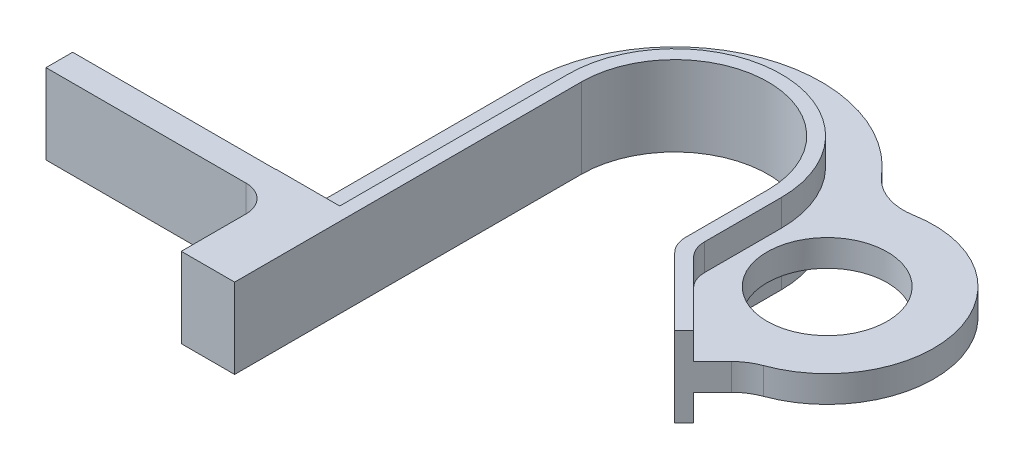
ISO-10303-21;
HEADER;
FILE_DESCRIPTION(('STEP AP214'),'2;1');
FILE_NAME('part.step','',(''),(''),'','','');
FILE_SCHEMA(('AUTOMOTIVE_DESIGN { 1 0 10303 214 1 1 1 1 }'));
ENDSEC;
DATA;
#1=APPLICATION_CONTEXT('core data for automotive mechanical design processes');
#2=APPLICATION_PROTOCOL_DEFINITION('international standard','automotive_design',2000,#1);
#3=PRODUCT_CONTEXT('',#1,'mechanical');
#4=PRODUCT('Part','Part','',(#3));
#5=PRODUCT_RELATED_PRODUCT_CATEGORY('part','',(#4));
#6=PRODUCT_DEFINITION_FORMATION('','',#4);
#7=PRODUCT_DEFINITION_CONTEXT('part definition',#1,'design');
#8=PRODUCT_DEFINITION('design','',#6,#7);
#9=PRODUCT_DEFINITION_SHAPE('','',#8);
#10=(LENGTH_UNIT() NAMED_UNIT(*) SI_UNIT(.MILLI.,.METRE.));
#11=(NAMED_UNIT(*) PLANE_ANGLE_UNIT() SI_UNIT($,.RADIAN.));
#12=(NAMED_UNIT(*) SI_UNIT($,.STERADIAN.) SOLID_ANGLE_UNIT());
#13=UNCERTAINTY_MEASURE_WITH_UNIT(LENGTH_MEASURE(1.E-05),#10,'distance_accuracy_value','');
#14=(GEOMETRIC_REPRESENTATION_CONTEXT(3) GLOBAL_UNCERTAINTY_ASSIGNED_CONTEXT((#13)) GLOBAL_UNIT_ASSIGNED_CONTEXT((#10,
#11,#12)) REPRESENTATION_CONTEXT('',''));
#15=CARTESIAN_POINT('',(0.,0.,0.));
#16=DIRECTION('',(0.,0.,1.));
#17=DIRECTION('',(1.,0.,0.));
#18=AXIS2_PLACEMENT_3D('',#15,#16,#17);
#19=CARTESIAN_POINT('',(-34.925,19.05,82.55));
#20=DIRECTION('',(1.,0.,0.));
#21=DIRECTION('',(0.,0.,-1.));
#22=AXIS2_PLACEMENT_3D('',#19,#20,#21);
#23=PLANE('',#22);
#24=DIRECTION('',(0.,0.,1.));
#25=VECTOR('',#24,1.);
#26=CARTESIAN_POINT('',(-34.925,19.05,54.356));
#27=LINE('',#26,#25);
#28=CARTESIAN_POINT('',(-34.925,19.05,67.1322));
#29=VERTEX_POINT('',#28);
#30=CARTESIAN_POINT('',(-34.925,19.05,82.55));
#31=VERTEX_POINT('',#30);
#32=EDGE_CURVE('E243',#29,#31,#27,.T.);
#33=ORIENTED_EDGE('',*,*,#32,.F.);
#34=DIRECTION('',(0.,1.,0.));
#35=VECTOR('',#34,1.);
#36=CARTESIAN_POINT('',(-34.925,0.,67.1322));
#37=LINE('',#36,#35);
#38=CARTESIAN_POINT('',(-34.925,0.,67.1322));
#39=VERTEX_POINT('',#38);
#40=EDGE_CURVE('E342',#29,#39,#37,.F.);
#41=ORIENTED_EDGE('',*,*,#40,.T.);
#42=DIRECTION('',(0.,0.,1.));
#43=VECTOR('',#42,1.);
#44=CARTESIAN_POINT('',(-34.925,0.,54.356));
#45=LINE('',#44,#43);
#46=CARTESIAN_POINT('',(-34.925,0.,82.55));
#47=VERTEX_POINT('',#46);
#48=EDGE_CURVE('E254',#39,#47,#45,.T.);
#49=ORIENTED_EDGE('',*,*,#48,.T.);
#50=DIRECTION('',(0.,-1.,0.));
#51=VECTOR('',#50,1.);
#52=CARTESIAN_POINT('',(-34.925,19.05,82.55));
#53=LINE('',#52,#51);
#54=EDGE_CURVE('E258',#31,#47,#53,.T.);
#55=ORIENTED_EDGE('',*,*,#54,.F.);
#56=EDGE_LOOP('',(#33,#41,#49,#55));
#57=FACE_BOUND('',#56,.T.);
#58=ADVANCED_FACE('F34',(#57),#23,.F.);
#59=DIRECTION('',(0.,0.,1.));
#60=VECTOR('',#59,1.);
#61=CARTESIAN_POINT('',(-34.925,6.35,0.));
#62=LINE('',#61,#60);
#63=CARTESIAN_POINT('',(-34.925,6.35,0.));
#64=VERTEX_POINT('',#63);
#65=CARTESIAN_POINT('',(-34.925,6.35,48.0822));
#66=VERTEX_POINT('',#65);
#67=EDGE_CURVE('E447',#64,#66,#62,.T.);
#68=ORIENTED_EDGE('',*,*,#67,.T.);
#69=DIRECTION('',(0.,-1.,0.));
#70=VECTOR('',#69,1.);
#71=CARTESIAN_POINT('',(-34.925,19.05,48.0822));
#72=LINE('',#71,#70);
#73=CARTESIAN_POINT('',(-34.925,12.7,48.0822));
#74=VERTEX_POINT('',#73);
#75=EDGE_CURVE('E350',#66,#74,#72,.F.);
#76=ORIENTED_EDGE('',*,*,#75,.T.);
#77=DIRECTION('',(0.,0.,1.));
#78=VECTOR('',#77,1.);
#79=CARTESIAN_POINT('',(-34.925,12.7,0.));
#80=LINE('',#79,#78);
#81=CARTESIAN_POINT('',(-34.925,12.7,0.));
#82=VERTEX_POINT('',#81);
#83=EDGE_CURVE('E469',#82,#74,#80,.T.);
#84=ORIENTED_EDGE('',*,*,#83,.F.);
#85=DIRECTION('',(0.,-1.,0.));
#86=VECTOR('',#85,1.);
#87=CARTESIAN_POINT('',(-34.925,19.05,0.));
#88=LINE('',#87,#86);
#89=EDGE_CURVE('E262',#82,#64,#88,.T.);
#90=ORIENTED_EDGE('',*,*,#89,.T.);
#91=EDGE_LOOP('',(#68,#76,#84,#90));
#92=FACE_BOUND('',#91,.T.);
#93=ADVANCED_FACE('F533',(#92),#23,.F.);
#94=CARTESIAN_POINT('',(-25.4,12.7,0.));
#95=DIRECTION('',(1.,0.,0.));
#96=DIRECTION('',(0.,0.,-1.));
#97=AXIS2_PLACEMENT_3D('',#94,#95,#96);
#98=PLANE('',#97);
#99=DIRECTION('',(0.,0.,-1.));
#100=VECTOR('',#99,1.);
#101=CARTESIAN_POINT('',(-25.4,12.7,0.));
#102=LINE('',#101,#100);
#103=CARTESIAN_POINT('',(-25.4,12.7,54.356));
#104=VERTEX_POINT('',#103);
#105=CARTESIAN_POINT('',(-25.4,12.7,0.));
#106=VERTEX_POINT('',#105);
#107=EDGE_CURVE('E473',#104,#106,#102,.T.);
#108=ORIENTED_EDGE('',*,*,#107,.F.);
#109=DIRECTION('',(0.,1.,0.));
#110=VECTOR('',#109,1.);
#111=CARTESIAN_POINT('',(-25.4,12.7,54.356));
#112=LINE('',#111,#110);
#113=CARTESIAN_POINT('',(-25.4,19.05,54.356));
#114=VERTEX_POINT('',#113);
#115=EDGE_CURVE('E410',#104,#114,#112,.T.);
#116=ORIENTED_EDGE('',*,*,#115,.T.);
#117=DIRECTION('',(0.,0.,-1.));
#118=VECTOR('',#117,1.);
#119=CARTESIAN_POINT('',(-25.4,19.05,0.));
#120=LINE('',#119,#118);
#121=CARTESIAN_POINT('',(-25.4,19.05,0.));
#122=VERTEX_POINT('',#121);
#123=EDGE_CURVE('E462',#114,#122,#120,.T.);
#124=ORIENTED_EDGE('',*,*,#123,.T.);
#125=DIRECTION('',(0.,1.,0.));
#126=VECTOR('',#125,1.);
#127=CARTESIAN_POINT('',(-25.4,12.7,0.));
#128=LINE('',#127,#126);
#129=EDGE_CURVE('E277',#106,#122,#128,.T.);
#130=ORIENTED_EDGE('',*,*,#129,.F.);
#131=EDGE_LOOP('',(#108,#116,#124,#130));
#132=FACE_BOUND('',#131,.T.);
#133=ADVANCED_FACE('F538',(#132),#98,.F.);
#134=CARTESIAN_POINT('',(0.,12.7,0.));
#135=DIRECTION('',(0.,1.,0.));
#136=DIRECTION('',(0.,0.,1.));
#137=AXIS2_PLACEMENT_3D('',#134,#135,#136);
#138=PLANE('',#137);
#139=CARTESIAN_POINT('',(42.884078450907,12.7,6.59427540420827));
#140=DIRECTION('',(0.,1.,0.));
#141=DIRECTION('',(0.,0.,1.));
#142=AXIS2_PLACEMENT_3D('',#139,#140,#141);
#143=CIRCLE('',#142,14.309078450907);
#144=CARTESIAN_POINT('',(42.884078450907,12.7,20.9033538551152));
#145=VERTEX_POINT('',#144);
#146=EDGE_CURVE('E399',#145,#145,#143,.T.);
#147=ORIENTED_EDGE('',*,*,#146,.F.);
#148=EDGE_LOOP('',(#147));
#149=FACE_BOUND('',#148,.T.);
#150=DIRECTION('',(0.707106781186551,0.,-0.707106781186544));
#151=VECTOR('',#150,1.);
#152=CARTESIAN_POINT('',(42.4305762724055,12.7,37.9404482118711));
#153=LINE('',#152,#151);
#154=CARTESIAN_POINT('',(42.4305762724055,12.7,37.9404482118711));
#155=VERTEX_POINT('',#154);
#156=CARTESIAN_POINT('',(46.966143844554,12.7,33.4048806397226));
#157=VERTEX_POINT('',#156);
#158=EDGE_CURVE('E483',#155,#157,#153,.T.);
#159=ORIENTED_EDGE('',*,*,#158,.T.);
#160=CARTESIAN_POINT('',(55.9463999656232,12.7,42.3851367607918));
#161=DIRECTION('',(0.,1.,0.));
#162=DIRECTION('',(0.,0.,1.));
#163=AXIS2_PLACEMENT_3D('',#160,#161,#162);
#164=CIRCLE('',#163,12.7);
#165=CARTESIAN_POINT('',(51.5922927940511,12.7,30.4548496419306));
#166=VERTEX_POINT('',#165);
#167=EDGE_CURVE('E11',#157,#166,#164,.F.);
#168=ORIENTED_EDGE('',*,*,#167,.T.);
#169=CARTESIAN_POINT('',(42.884078450907,12.7,6.59427540420827));
#170=DIRECTION('',(0.,1.,0.));
#171=DIRECTION('',(0.,0.,1.));
#172=AXIS2_PLACEMENT_3D('',#169,#170,#171);
#173=CIRCLE('',#172,25.4);
#174=CARTESIAN_POINT('',(38.4437998998661,12.7,-18.4146015475696));
#175=VERTEX_POINT('',#174);
#176=EDGE_CURVE('E387',#166,#175,#173,.T.);
#177=ORIENTED_EDGE('',*,*,#176,.T.);
#178=CARTESIAN_POINT('',(36.2236606243456,12.7,-30.9190400234585));
#179=DIRECTION('',(0.,1.,0.));
#180=DIRECTION('',(0.,0.,1.));
#181=AXIS2_PLACEMENT_3D('',#178,#179,#180);
#182=CIRCLE('',#181,12.7);
#183=CARTESIAN_POINT('',(26.5640177911868,12.7,-22.6739626838696));
#184=VERTEX_POINT('',#183);
#185=EDGE_CURVE('E373',#175,#184,#182,.F.);
#186=ORIENTED_EDGE('',*,*,#185,.T.);
#187=CARTESIAN_POINT('',(0.,12.7,0.));
#188=DIRECTION('',(0.,1.,0.));
#189=DIRECTION('',(0.,0.,1.));
#190=AXIS2_PLACEMENT_3D('',#187,#188,#189);
#191=CIRCLE('',#190,34.925);
#192=EDGE_CURVE('E467',#184,#82,#191,.T.);
#193=ORIENTED_EDGE('',*,*,#192,.T.);
#194=ORIENTED_EDGE('',*,*,#83,.T.);
#195=CARTESIAN_POINT('',(-41.275,12.7,48.0822));
#196=DIRECTION('',(0.,1.,0.));
#197=DIRECTION('',(0.,0.,1.));
#198=AXIS2_PLACEMENT_3D('',#195,#196,#197);
#199=CIRCLE('',#198,6.35);
#200=CARTESIAN_POINT('',(-40.2942178835211,12.7,54.356));
#201=VERTEX_POINT('',#200);
#202=EDGE_CURVE('E360',#74,#201,#199,.F.);
#203=ORIENTED_EDGE('',*,*,#202,.T.);
#204=DIRECTION('',(-1.,0.,0.));
#205=VECTOR('',#204,1.);
#206=CARTESIAN_POINT('',(0.,12.7,54.356));
#207=LINE('',#206,#205);
#208=EDGE_CURVE('E408',#104,#201,#207,.T.);
#209=ORIENTED_EDGE('',*,*,#208,.F.);
#210=ORIENTED_EDGE('',*,*,#107,.T.);
#211=CARTESIAN_POINT('',(0.,12.7,0.));
#212=DIRECTION('',(0.,-1.,0.));
#213=DIRECTION('',(0.,0.,1.));
#214=AXIS2_PLACEMENT_3D('',#211,#212,#213);
#215=CIRCLE('',#214,25.4);
#216=CARTESIAN_POINT('',(25.4,12.7,0.));
#217=VERTEX_POINT('',#216);
#218=EDGE_CURVE('E475',#106,#217,#215,.T.);
#219=ORIENTED_EDGE('',*,*,#218,.T.);
#220=DIRECTION('',(0.,0.,1.));
#221=VECTOR('',#220,1.);
#222=CARTESIAN_POINT('',(25.4,12.7,20.9098719394655));
#223=LINE('',#222,#221);
#224=CARTESIAN_POINT('',(25.4,12.7,18.2796158183963));
#225=VERTEX_POINT('',#224);
#226=EDGE_CURVE('E478',#217,#225,#223,.T.);
#227=ORIENTED_EDGE('',*,*,#226,.T.);
#228=CARTESIAN_POINT('',(31.75,12.7,18.2796158183963));
#229=DIRECTION('',(0.,1.,0.));
#230=DIRECTION('',(0.,0.,1.));
#231=AXIS2_PLACEMENT_3D('',#228,#229,#230);
#232=CIRCLE('',#231,6.35);
#233=CARTESIAN_POINT('',(27.2598719394654,12.7,22.7697438789309));
#234=VERTEX_POINT('',#233);
#235=EDGE_CURVE('E324',#225,#234,#232,.T.);
#236=ORIENTED_EDGE('',*,*,#235,.T.);
#237=DIRECTION('',(0.707106781186544,0.,0.707106781186551));
#238=VECTOR('',#237,1.);
#239=CARTESIAN_POINT('',(42.4305762724055,12.7,37.9404482118711));
#240=LINE('',#239,#238);
#241=EDGE_CURVE('E481',#234,#155,#240,.T.);
#242=ORIENTED_EDGE('',*,*,#241,.T.);
#243=EDGE_LOOP('',(#159,#168,#177,#186,#193,#194,#203,#209,#210,#219,#227,#236,#242));
#244=FACE_BOUND('',#243,.T.);
#245=ADVANCED_FACE('F516',(#149,#244),#138,.T.);
#246=CARTESIAN_POINT('',(-25.4,6.35,0.));
#247=DIRECTION('',(-1.,0.,0.));
#248=DIRECTION('',(0.,0.,1.));
#249=AXIS2_PLACEMENT_3D('',#246,#247,#248);
#250=PLANE('',#249);
#251=DIRECTION('',(0.,-1.,0.));
#252=VECTOR('',#251,1.);
#253=CARTESIAN_POINT('',(-25.4,6.35,54.356));
#254=LINE('',#253,#252);
#255=CARTESIAN_POINT('',(-25.4,6.35,54.356));
#256=VERTEX_POINT('',#255);
#257=CARTESIAN_POINT('',(-25.4,0.,54.356));
#258=VERTEX_POINT('',#257);
#259=EDGE_CURVE('E406',#256,#258,#254,.T.);
#260=ORIENTED_EDGE('',*,*,#259,.F.);
#261=DIRECTION('',(0.,0.,-1.));
#262=VECTOR('',#261,1.);
#263=CARTESIAN_POINT('',(-25.4,6.35,0.));
#264=LINE('',#263,#262);
#265=CARTESIAN_POINT('',(-25.4,6.35,0.));
#266=VERTEX_POINT('',#265);
#267=EDGE_CURVE('E445',#256,#266,#264,.T.);
#268=ORIENTED_EDGE('',*,*,#267,.T.);
#269=DIRECTION('',(0.,-1.,0.));
#270=VECTOR('',#269,1.);
#271=CARTESIAN_POINT('',(-25.4,6.35,0.));
#272=LINE('',#271,#270);
#273=CARTESIAN_POINT('',(-25.4,0.,0.));
#274=VERTEX_POINT('',#273);
#275=EDGE_CURVE('E459',#266,#274,#272,.T.);
#276=ORIENTED_EDGE('',*,*,#275,.T.);
#277=DIRECTION('',(0.,0.,-1.));
#278=VECTOR('',#277,1.);
#279=CARTESIAN_POINT('',(-25.4,0.,0.));
#280=LINE('',#279,#278);
#281=EDGE_CURVE('E436',#258,#274,#280,.T.);
#282=ORIENTED_EDGE('',*,*,#281,.F.);
#283=EDGE_LOOP('',(#260,#268,#276,#282));
#284=FACE_BOUND('',#283,.T.);
#285=ADVANCED_FACE('F604',(#284),#250,.T.);
#286=CARTESIAN_POINT('',(0.,6.35,0.));
#287=DIRECTION('',(0.,-1.,0.));
#288=DIRECTION('',(0.,0.,1.));
#289=AXIS2_PLACEMENT_3D('',#286,#287,#288);
#290=PLANE('',#289);
#291=CARTESIAN_POINT('',(42.884078450907,6.35,6.59427540420827));
#292=DIRECTION('',(0.,-1.,0.));
#293=DIRECTION('',(0.,0.,-1.));
#294=AXIS2_PLACEMENT_3D('',#291,#292,#293);
#295=CIRCLE('',#294,14.309078450907);
#296=CARTESIAN_POINT('',(42.884078450907,6.35,-7.71480304669871));
#297=VERTEX_POINT('',#296);
#298=EDGE_CURVE('E38',#297,#297,#295,.T.);
#299=ORIENTED_EDGE('',*,*,#298,.F.);
#300=EDGE_LOOP('',(#299));
#301=FACE_BOUND('',#300,.T.);
#302=CARTESIAN_POINT('',(0.,6.35,0.));
#303=DIRECTION('',(0.,1.,0.));
#304=DIRECTION('',(0.,0.,1.));
#305=AXIS2_PLACEMENT_3D('',#302,#303,#304);
#306=CIRCLE('',#305,34.925);
#307=CARTESIAN_POINT('',(26.5640177911868,6.35,-22.6739626838696));
#308=VERTEX_POINT('',#307);
#309=EDGE_CURVE('E433',#308,#64,#306,.T.);
#310=ORIENTED_EDGE('',*,*,#309,.F.);
#311=CARTESIAN_POINT('',(36.2236606243456,6.35,-30.9190400234585));
#312=DIRECTION('',(0.,-1.,0.));
#313=DIRECTION('',(0.,0.,-1.));
#314=AXIS2_PLACEMENT_3D('',#311,#312,#313);
#315=CIRCLE('',#314,12.7);
#316=CARTESIAN_POINT('',(38.4437998998661,6.35,-18.4146015475696));
#317=VERTEX_POINT('',#316);
#318=EDGE_CURVE('E375',#308,#317,#315,.F.);
#319=ORIENTED_EDGE('',*,*,#318,.T.);
#320=CARTESIAN_POINT('',(42.884078450907,6.35,6.59427540420827));
#321=DIRECTION('',(0.,1.,0.));
#322=DIRECTION('',(0.,0.,1.));
#323=AXIS2_PLACEMENT_3D('',#320,#321,#322);
#324=CIRCLE('',#323,25.4);
#325=CARTESIAN_POINT('',(51.5922927940511,6.35,30.4548496419306));
#326=VERTEX_POINT('',#325);
#327=EDGE_CURVE('E386',#326,#317,#324,.T.);
#328=ORIENTED_EDGE('',*,*,#327,.F.);
#329=CARTESIAN_POINT('',(55.9463999656232,6.35,42.3851367607918));
#330=DIRECTION('',(0.,-1.,0.));
#331=DIRECTION('',(0.,0.,-1.));
#332=AXIS2_PLACEMENT_3D('',#329,#330,#331);
#333=CIRCLE('',#332,12.7);
#334=CARTESIAN_POINT('',(46.966143844554,6.35,33.4048806397226));
#335=VERTEX_POINT('',#334);
#336=EDGE_CURVE('E43',#326,#335,#333,.F.);
#337=ORIENTED_EDGE('',*,*,#336,.T.);
#338=DIRECTION('',(0.707106781186551,0.,-0.707106781186544));
#339=VECTOR('',#338,1.);
#340=CARTESIAN_POINT('',(42.4305762724055,6.35,37.9404482118711));
#341=LINE('',#340,#339);
#342=CARTESIAN_POINT('',(42.4305762724055,6.35,37.9404482118711));
#343=VERTEX_POINT('',#342);
#344=EDGE_CURVE('E435',#343,#335,#341,.T.);
#345=ORIENTED_EDGE('',*,*,#344,.F.);
#346=DIRECTION('',(0.707106781186544,0.,0.707106781186551));
#347=VECTOR('',#346,1.);
#348=CARTESIAN_POINT('',(42.4305762724055,6.35,37.9404482118711));
#349=LINE('',#348,#347);
#350=CARTESIAN_POINT('',(27.2598719394654,6.35,22.7697438789309));
#351=VERTEX_POINT('',#350);
#352=EDGE_CURVE('E438',#351,#343,#349,.T.);
#353=ORIENTED_EDGE('',*,*,#352,.F.);
#354=CARTESIAN_POINT('',(31.75,6.35,18.2796158183963));
#355=DIRECTION('',(0.,-1.,0.));
#356=DIRECTION('',(0.,0.,-1.));
#357=AXIS2_PLACEMENT_3D('',#354,#355,#356);
#358=CIRCLE('',#357,6.35);
#359=CARTESIAN_POINT('',(25.4,6.35,18.2796158183963));
#360=VERTEX_POINT('',#359);
#361=EDGE_CURVE('E317',#351,#360,#358,.T.);
#362=ORIENTED_EDGE('',*,*,#361,.T.);
#363=DIRECTION('',(0.,0.,1.));
#364=VECTOR('',#363,1.);
#365=CARTESIAN_POINT('',(25.4,6.35,20.9098719394655));
#366=LINE('',#365,#364);
#367=CARTESIAN_POINT('',(25.4,6.35,0.));
#368=VERTEX_POINT('',#367);
#369=EDGE_CURVE('E440',#368,#360,#366,.T.);
#370=ORIENTED_EDGE('',*,*,#369,.F.);
#371=CARTESIAN_POINT('',(0.,6.35,0.));
#372=DIRECTION('',(0.,-1.,0.));
#373=DIRECTION('',(0.,0.,1.));
#374=AXIS2_PLACEMENT_3D('',#371,#372,#373);
#375=CIRCLE('',#374,25.4);
#376=EDGE_CURVE('E443',#266,#368,#375,.T.);
#377=ORIENTED_EDGE('',*,*,#376,.F.);
#378=ORIENTED_EDGE('',*,*,#267,.F.);
#379=DIRECTION('',(1.,0.,0.));
#380=VECTOR('',#379,1.);
#381=CARTESIAN_POINT('',(0.,6.35,54.356));
#382=LINE('',#381,#380);
#383=CARTESIAN_POINT('',(-40.2942178835211,6.35,54.356));
#384=VERTEX_POINT('',#383);
#385=EDGE_CURVE('E403',#384,#256,#382,.T.);
#386=ORIENTED_EDGE('',*,*,#385,.F.);
#387=CARTESIAN_POINT('',(-41.275,6.35,48.0822));
#388=DIRECTION('',(0.,-1.,0.));
#389=DIRECTION('',(0.,0.,-1.));
#390=AXIS2_PLACEMENT_3D('',#387,#388,#389);
#391=CIRCLE('',#390,6.35);
#392=EDGE_CURVE('E358',#384,#66,#391,.F.);
#393=ORIENTED_EDGE('',*,*,#392,.T.);
#394=ORIENTED_EDGE('',*,*,#67,.F.);
#395=EDGE_LOOP('',(#310,#319,#328,#337,#345,#353,#362,#370,#377,#378,#386,#393,#394));
#396=FACE_BOUND('',#395,.T.);
#397=ADVANCED_FACE('F391',(#301,#396),#290,.T.);
#398=CARTESIAN_POINT('',(0.,19.05,0.));
#399=DIRECTION('',(0.,-1.,0.));
#400=DIRECTION('',(0.,0.,-1.));
#401=AXIS2_PLACEMENT_3D('',#398,#399,#400);
#402=CYLINDRICAL_SURFACE('',#401,34.925);
#403=ORIENTED_EDGE('',*,*,#192,.F.);
#404=DIRECTION('',(0.,-1.,0.));
#405=VECTOR('',#404,1.);
#406=CARTESIAN_POINT('',(26.5640177911868,19.05,-22.6739626838696));
#407=LINE('',#406,#405);
#408=EDGE_CURVE('E371',#184,#308,#407,.T.);
#409=ORIENTED_EDGE('',*,*,#408,.T.);
#410=ORIENTED_EDGE('',*,*,#309,.T.);
#411=ORIENTED_EDGE('',*,*,#89,.F.);
#412=EDGE_LOOP('',(#403,#409,#410,#411));
#413=FACE_BOUND('',#412,.T.);
#414=ADVANCED_FACE('F543',(#413),#402,.T.);
#415=CARTESIAN_POINT('',(-22.225,19.05,82.55));
#416=DIRECTION('',(0.,0.,-1.));
#417=DIRECTION('',(-1.,0.,0.));
#418=AXIS2_PLACEMENT_3D('',#415,#416,#417);
#419=PLANE('',#418);
#420=DIRECTION('',(1.,0.,0.));
#421=VECTOR('',#420,1.);
#422=CARTESIAN_POINT('',(-22.225,19.05,82.55));
#423=LINE('',#422,#421);
#424=CARTESIAN_POINT('',(-22.225,19.05,82.55));
#425=VERTEX_POINT('',#424);
#426=EDGE_CURVE('E248',#31,#425,#423,.T.);
#427=ORIENTED_EDGE('',*,*,#426,.F.);
#428=ORIENTED_EDGE('',*,*,#54,.T.);
#429=DIRECTION('',(1.,0.,0.));
#430=VECTOR('',#429,1.);
#431=CARTESIAN_POINT('',(-22.225,0.,82.55));
#432=LINE('',#431,#430);
#433=CARTESIAN_POINT('',(-22.225,0.,82.55));
#434=VERTEX_POINT('',#433);
#435=EDGE_CURVE('E290',#47,#434,#432,.T.);
#436=ORIENTED_EDGE('',*,*,#435,.T.);
#437=DIRECTION('',(0.,-1.,0.));
#438=VECTOR('',#437,1.);
#439=CARTESIAN_POINT('',(-22.225,19.05,82.55));
#440=LINE('',#439,#438);
#441=EDGE_CURVE('E263',#425,#434,#440,.T.);
#442=ORIENTED_EDGE('',*,*,#441,.F.);
#443=EDGE_LOOP('',(#427,#428,#436,#442));
#444=FACE_BOUND('',#443,.T.);
#445=ADVANCED_FACE('F265',(#444),#419,.F.);
#446=CARTESIAN_POINT('',(40.1855122421382,19.05,40.1855122421384));
#447=DIRECTION('',(-0.707106781186546,0.,-0.707106781186549));
#448=DIRECTION('',(-0.707106781186549,0.,0.707106781186546));
#449=AXIS2_PLACEMENT_3D('',#446,#447,#448);
#450=PLANE('',#449);
#451=ORIENTED_EDGE('',*,*,#344,.T.);
#452=DIRECTION('',(0.,1.,0.));
#453=VECTOR('',#452,1.);
#454=CARTESIAN_POINT('',(46.966143844554,19.05,33.4048806397226));
#455=LINE('',#454,#453);
#456=EDGE_CURVE('E50',#335,#157,#455,.T.);
#457=ORIENTED_EDGE('',*,*,#456,.T.);
#458=ORIENTED_EDGE('',*,*,#158,.F.);
#459=DIRECTION('',(0.,1.,0.));
#460=VECTOR('',#459,1.);
#461=CARTESIAN_POINT('',(42.4305762724055,12.7,37.9404482118711));
#462=LINE('',#461,#460);
#463=CARTESIAN_POINT('',(42.4305762724055,19.05,37.9404482118711));
#464=VERTEX_POINT('',#463);
#465=EDGE_CURVE('E293',#155,#464,#462,.T.);
#466=ORIENTED_EDGE('',*,*,#465,.T.);
#467=DIRECTION('',(0.707106781186549,0.,-0.707106781186546));
#468=VECTOR('',#467,1.);
#469=CARTESIAN_POINT('',(40.1855122421382,19.05,40.1855122421384));
#470=LINE('',#469,#468);
#471=CARTESIAN_POINT('',(40.1855122421382,19.05,40.1855122421384));
#472=VERTEX_POINT('',#471);
#473=EDGE_CURVE('E286',#472,#464,#470,.T.);
#474=ORIENTED_EDGE('',*,*,#473,.F.);
#475=DIRECTION('',(0.,-1.,0.));
#476=VECTOR('',#475,1.);
#477=CARTESIAN_POINT('',(40.1855122421382,19.05,40.1855122421384));
#478=LINE('',#477,#476);
#479=CARTESIAN_POINT('',(40.1855122421382,0.,40.1855122421384));
#480=VERTEX_POINT('',#479);
#481=EDGE_CURVE('E289',#472,#480,#478,.T.);
#482=ORIENTED_EDGE('',*,*,#481,.T.);
#483=DIRECTION('',(0.707106781186549,0.,-0.707106781186546));
#484=VECTOR('',#483,1.);
#485=CARTESIAN_POINT('',(40.1855122421382,0.,40.1855122421384));
#486=LINE('',#485,#484);
#487=CARTESIAN_POINT('',(42.4305762724055,0.,37.9404482118711));
#488=VERTEX_POINT('',#487);
#489=EDGE_CURVE('E269',#480,#488,#486,.T.);
#490=ORIENTED_EDGE('',*,*,#489,.T.);
#491=DIRECTION('',(0.,-1.,0.));
#492=VECTOR('',#491,1.);
#493=CARTESIAN_POINT('',(42.4305762724055,6.35,37.9404482118711));
#494=LINE('',#493,#492);
#495=EDGE_CURVE('E450',#343,#488,#494,.T.);
#496=ORIENTED_EDGE('',*,*,#495,.F.);
#497=EDGE_LOOP('',(#451,#457,#458,#466,#474,#482,#490,#496));
#498=FACE_BOUND('',#497,.T.);
#499=ADVANCED_FACE('F521',(#498),#450,.F.);
#500=CARTESIAN_POINT('',(0.,0.,0.));
#501=DIRECTION('',(0.,1.,0.));
#502=DIRECTION('',(0.,0.,1.));
#503=AXIS2_PLACEMENT_3D('',#500,#501,#502);
#504=PLANE('',#503);
#505=DIRECTION('',(1.,0.,0.));
#506=VECTOR('',#505,1.);
#507=CARTESIAN_POINT('',(-22.225,0.,54.356));
#508=LINE('',#507,#506);
#509=CARTESIAN_POINT('',(-40.2942178835211,0.,54.356));
#510=VERTEX_POINT('',#509);
#511=EDGE_CURVE('E255',#510,#258,#508,.T.);
#512=ORIENTED_EDGE('',*,*,#511,.T.);
#513=ORIENTED_EDGE('',*,*,#281,.T.);
#514=CARTESIAN_POINT('',(0.,0.,0.));
#515=DIRECTION('',(0.,-1.,0.));
#516=DIRECTION('',(0.,0.,1.));
#517=AXIS2_PLACEMENT_3D('',#514,#515,#516);
#518=CIRCLE('',#517,25.4);
#519=CARTESIAN_POINT('',(25.4,0.,0.));
#520=VERTEX_POINT('',#519);
#521=EDGE_CURVE('E455',#274,#520,#518,.T.);
#522=ORIENTED_EDGE('',*,*,#521,.T.);
#523=DIRECTION('',(0.,0.,1.));
#524=VECTOR('',#523,1.);
#525=CARTESIAN_POINT('',(25.4,0.,20.9098719394655));
#526=LINE('',#525,#524);
#527=CARTESIAN_POINT('',(25.4,0.,18.2796158183963));
#528=VERTEX_POINT('',#527);
#529=EDGE_CURVE('E452',#520,#528,#526,.T.);
#530=ORIENTED_EDGE('',*,*,#529,.T.);
#531=CARTESIAN_POINT('',(31.75,0.,18.2796158183963));
#532=DIRECTION('',(0.,1.,0.));
#533=DIRECTION('',(0.,0.,1.));
#534=AXIS2_PLACEMENT_3D('',#531,#532,#533);
#535=CIRCLE('',#534,6.35);
#536=CARTESIAN_POINT('',(27.2598719394654,0.,22.7697438789309));
#537=VERTEX_POINT('',#536);
#538=EDGE_CURVE('E326',#528,#537,#535,.T.);
#539=ORIENTED_EDGE('',*,*,#538,.T.);
#540=DIRECTION('',(0.707106781186544,0.,0.707106781186551));
#541=VECTOR('',#540,1.);
#542=CARTESIAN_POINT('',(42.4305762724055,0.,37.9404482118711));
#543=LINE('',#542,#541);
#544=EDGE_CURVE('E432',#537,#488,#543,.T.);
#545=ORIENTED_EDGE('',*,*,#544,.T.);
#546=ORIENTED_EDGE('',*,*,#489,.F.);
#547=DIRECTION('',(0.707106781186544,0.,0.707106781186551));
#548=VECTOR('',#547,1.);
#549=CARTESIAN_POINT('',(22.225,0.,22.225));
#550=LINE('',#549,#548);
#551=CARTESIAN_POINT('',(24.0848719394654,0.,24.0848719394654));
#552=VERTEX_POINT('',#551);
#553=EDGE_CURVE('E274',#552,#480,#550,.T.);
#554=ORIENTED_EDGE('',*,*,#553,.F.);
#555=CARTESIAN_POINT('',(28.575,0.,19.5947438789309));
#556=DIRECTION('',(0.,1.,0.));
#557=DIRECTION('',(0.,0.,1.));
#558=AXIS2_PLACEMENT_3D('',#555,#556,#557);
#559=CIRCLE('',#558,6.35);
#560=CARTESIAN_POINT('',(22.225,0.,19.5947438789309));
#561=VERTEX_POINT('',#560);
#562=EDGE_CURVE('E333',#552,#561,#559,.F.);
#563=ORIENTED_EDGE('',*,*,#562,.T.);
#564=DIRECTION('',(0.,0.,1.));
#565=VECTOR('',#564,1.);
#566=CARTESIAN_POINT('',(22.225,0.,22.225));
#567=LINE('',#566,#565);
#568=CARTESIAN_POINT('',(22.225,0.,0.));
#569=VERTEX_POINT('',#568);
#570=EDGE_CURVE('E297',#569,#561,#567,.T.);
#571=ORIENTED_EDGE('',*,*,#570,.F.);
#572=CARTESIAN_POINT('',(0.,0.,0.));
#573=DIRECTION('',(0.,-1.,0.));
#574=DIRECTION('',(0.,0.,1.));
#575=AXIS2_PLACEMENT_3D('',#572,#573,#574);
#576=CIRCLE('',#575,22.225);
#577=CARTESIAN_POINT('',(-22.225,0.,0.));
#578=VERTEX_POINT('',#577);
#579=EDGE_CURVE('E295',#578,#569,#576,.T.);
#580=ORIENTED_EDGE('',*,*,#579,.F.);
#581=DIRECTION('',(0.,0.,-1.));
#582=VECTOR('',#581,1.);
#583=CARTESIAN_POINT('',(-22.225,0.,0.));
#584=LINE('',#583,#582);
#585=EDGE_CURVE('E292',#434,#578,#584,.T.);
#586=ORIENTED_EDGE('',*,*,#585,.F.);
#587=ORIENTED_EDGE('',*,*,#435,.F.);
#588=ORIENTED_EDGE('',*,*,#48,.F.);
#589=CARTESIAN_POINT('',(-41.275,0.,67.1322));
#590=DIRECTION('',(0.,1.,0.));
#591=DIRECTION('',(0.,0.,1.));
#592=AXIS2_PLACEMENT_3D('',#589,#590,#591);
#593=CIRCLE('',#592,6.35);
#594=CARTESIAN_POINT('',(-41.275,0.,60.7822));
#595=VERTEX_POINT('',#594);
#596=EDGE_CURVE('E345',#39,#595,#593,.T.);
#597=ORIENTED_EDGE('',*,*,#596,.T.);
#598=DIRECTION('',(1.,0.,0.));
#599=VECTOR('',#598,1.);
#600=CARTESIAN_POINT('',(-88.9,0.,60.7822));
#601=LINE('',#600,#599);
#602=CARTESIAN_POINT('',(-88.9,0.,60.7822));
#603=VERTEX_POINT('',#602);
#604=EDGE_CURVE('E421',#603,#595,#601,.T.);
#605=ORIENTED_EDGE('',*,*,#604,.F.);
#606=DIRECTION('',(0.,0.,1.));
#607=VECTOR('',#606,1.);
#608=CARTESIAN_POINT('',(-88.9,0.,60.7822));
#609=LINE('',#608,#607);
#610=CARTESIAN_POINT('',(-88.9,0.,54.4322));
#611=VERTEX_POINT('',#610);
#612=EDGE_CURVE('E419',#611,#603,#609,.T.);
#613=ORIENTED_EDGE('',*,*,#612,.F.);
#614=DIRECTION('',(1.,0.,0.));
#615=VECTOR('',#614,1.);
#616=CARTESIAN_POINT('',(-88.9,0.,54.4322));
#617=LINE('',#616,#615);
#618=CARTESIAN_POINT('',(-41.275,0.,54.4322));
#619=VERTEX_POINT('',#618);
#620=EDGE_CURVE('E424',#611,#619,#617,.T.);
#621=ORIENTED_EDGE('',*,*,#620,.T.);
#622=CARTESIAN_POINT('',(-41.275,0.,48.0822));
#623=DIRECTION('',(0.,1.,0.));
#624=DIRECTION('',(0.,0.,1.));
#625=AXIS2_PLACEMENT_3D('',#622,#623,#624);
#626=CIRCLE('',#625,6.35);
#627=EDGE_CURVE('E352',#619,#510,#626,.T.);
#628=ORIENTED_EDGE('',*,*,#627,.T.);
#629=EDGE_LOOP('',(#512,#513,#522,#530,#539,#545,#546,#554,#563,#571,#580,#586,#587,#588,#597,
#605,#613,#621,#628));
#630=FACE_BOUND('',#629,.T.);
#631=ADVANCED_FACE('F588',(#630),#504,.F.);
#632=CARTESIAN_POINT('',(-22.225,19.05,0.));
#633=DIRECTION('',(-1.,0.,0.));
#634=DIRECTION('',(0.,0.,1.));
#635=AXIS2_PLACEMENT_3D('',#632,#633,#634);
#636=PLANE('',#635);
#637=DIRECTION('',(0.,-1.,0.));
#638=VECTOR('',#637,1.);
#639=CARTESIAN_POINT('',(-22.225,19.05,0.));
#640=LINE('',#639,#638);
#641=CARTESIAN_POINT('',(-22.225,19.05,0.));
#642=VERTEX_POINT('',#641);
#643=EDGE_CURVE('E306',#642,#578,#640,.T.);
#644=ORIENTED_EDGE('',*,*,#643,.F.);
#645=DIRECTION('',(0.,0.,-1.));
#646=VECTOR('',#645,1.);
#647=CARTESIAN_POINT('',(-22.225,19.05,0.));
#648=LINE('',#647,#646);
#649=EDGE_CURVE('E268',#425,#642,#648,.T.);
#650=ORIENTED_EDGE('',*,*,#649,.F.);
#651=ORIENTED_EDGE('',*,*,#441,.T.);
#652=ORIENTED_EDGE('',*,*,#585,.T.);
#653=EDGE_LOOP('',(#644,#650,#651,#652));
#654=FACE_BOUND('',#653,.T.);
#655=ADVANCED_FACE('F615',(#654),#636,.F.);
#656=CARTESIAN_POINT('',(0.,19.05,0.));
#657=DIRECTION('',(0.,-1.,0.));
#658=DIRECTION('',(0.,0.,-1.));
#659=AXIS2_PLACEMENT_3D('',#656,#657,#658);
#660=CYLINDRICAL_SURFACE('',#659,22.225);
#661=ORIENTED_EDGE('',*,*,#579,.T.);
#662=DIRECTION('',(0.,-1.,0.));
#663=VECTOR('',#662,1.);
#664=CARTESIAN_POINT('',(22.225,19.05,0.));
#665=LINE('',#664,#663);
#666=CARTESIAN_POINT('',(22.225,19.05,0.));
#667=VERTEX_POINT('',#666);
#668=EDGE_CURVE('E303',#667,#569,#665,.T.);
#669=ORIENTED_EDGE('',*,*,#668,.F.);
#670=CARTESIAN_POINT('',(0.,19.05,0.));
#671=DIRECTION('',(0.,-1.,0.));
#672=DIRECTION('',(0.,0.,1.));
#673=AXIS2_PLACEMENT_3D('',#670,#671,#672);
#674=CIRCLE('',#673,22.225);
#675=EDGE_CURVE('E271',#642,#667,#674,.T.);
#676=ORIENTED_EDGE('',*,*,#675,.F.);
#677=ORIENTED_EDGE('',*,*,#643,.T.);
#678=EDGE_LOOP('',(#661,#669,#676,#677));
#679=FACE_BOUND('',#678,.T.);
#680=ADVANCED_FACE('F624',(#679),#660,.F.);
#681=CARTESIAN_POINT('',(22.225,19.05,22.225));
#682=DIRECTION('',(1.,0.,0.));
#683=DIRECTION('',(0.,0.,-1.));
#684=AXIS2_PLACEMENT_3D('',#681,#682,#683);
#685=PLANE('',#684);
#686=ORIENTED_EDGE('',*,*,#570,.T.);
#687=DIRECTION('',(0.,-1.,0.));
#688=VECTOR('',#687,1.);
#689=CARTESIAN_POINT('',(22.225,19.05,19.5947438789309));
#690=LINE('',#689,#688);
#691=CARTESIAN_POINT('',(22.225,19.05,19.5947438789309));
#692=VERTEX_POINT('',#691);
#693=EDGE_CURVE('E335',#561,#692,#690,.F.);
#694=ORIENTED_EDGE('',*,*,#693,.T.);
#695=DIRECTION('',(0.,0.,1.));
#696=VECTOR('',#695,1.);
#697=CARTESIAN_POINT('',(22.225,19.05,22.225));
#698=LINE('',#697,#696);
#699=EDGE_CURVE('E281',#667,#692,#698,.T.);
#700=ORIENTED_EDGE('',*,*,#699,.F.);
#701=ORIENTED_EDGE('',*,*,#668,.T.);
#702=EDGE_LOOP('',(#686,#694,#700,#701));
#703=FACE_BOUND('',#702,.T.);
#704=ADVANCED_FACE('F620',(#703),#685,.F.);
#705=CARTESIAN_POINT('',(22.225,19.05,22.225));
#706=DIRECTION('',(0.707106781186551,0.,-0.707106781186544));
#707=DIRECTION('',(-0.707106781186544,0.,-0.707106781186551));
#708=AXIS2_PLACEMENT_3D('',#705,#706,#707);
#709=PLANE('',#708);
#710=DIRECTION('',(0.707106781186544,0.,0.707106781186551));
#711=VECTOR('',#710,1.);
#712=CARTESIAN_POINT('',(22.225,19.05,22.225));
#713=LINE('',#712,#711);
#714=CARTESIAN_POINT('',(24.0848719394654,19.05,24.0848719394654));
#715=VERTEX_POINT('',#714);
#716=EDGE_CURVE('E284',#715,#472,#713,.T.);
#717=ORIENTED_EDGE('',*,*,#716,.F.);
#718=DIRECTION('',(0.,-1.,0.));
#719=VECTOR('',#718,1.);
#720=CARTESIAN_POINT('',(24.0848719394654,19.05,24.0848719394654));
#721=LINE('',#720,#719);
#722=EDGE_CURVE('E330',#715,#552,#721,.T.);
#723=ORIENTED_EDGE('',*,*,#722,.T.);
#724=ORIENTED_EDGE('',*,*,#553,.T.);
#725=ORIENTED_EDGE('',*,*,#481,.F.);
#726=EDGE_LOOP('',(#717,#723,#724,#725));
#727=FACE_BOUND('',#726,.T.);
#728=ADVANCED_FACE('F612',(#727),#709,.F.);
#729=CARTESIAN_POINT('',(0.,19.05,0.));
#730=DIRECTION('',(0.,1.,0.));
#731=DIRECTION('',(0.,0.,1.));
#732=AXIS2_PLACEMENT_3D('',#729,#730,#731);
#733=PLANE('',#732);
#734=ORIENTED_EDGE('',*,*,#123,.F.);
#735=DIRECTION('',(-1.,0.,0.));
#736=VECTOR('',#735,1.);
#737=CARTESIAN_POINT('',(-22.225,19.05,54.356));
#738=LINE('',#737,#736);
#739=CARTESIAN_POINT('',(-40.2942178835211,19.05,54.356));
#740=VERTEX_POINT('',#739);
#741=EDGE_CURVE('E394',#114,#740,#738,.T.);
#742=ORIENTED_EDGE('',*,*,#741,.T.);
#743=CARTESIAN_POINT('',(-41.275,19.05,48.0822));
#744=DIRECTION('',(0.,1.,0.));
#745=DIRECTION('',(0.,0.,1.));
#746=AXIS2_PLACEMENT_3D('',#743,#744,#745);
#747=CIRCLE('',#746,6.35);
#748=CARTESIAN_POINT('',(-41.275,19.05,54.4322));
#749=VERTEX_POINT('',#748);
#750=EDGE_CURVE('E366',#740,#749,#747,.F.);
#751=ORIENTED_EDGE('',*,*,#750,.T.);
#752=DIRECTION('',(1.,0.,0.));
#753=VECTOR('',#752,1.);
#754=CARTESIAN_POINT('',(-88.9,19.05,54.4322));
#755=LINE('',#754,#753);
#756=CARTESIAN_POINT('',(-88.9,19.05,54.4322));
#757=VERTEX_POINT('',#756);
#758=EDGE_CURVE('E427',#757,#749,#755,.T.);
#759=ORIENTED_EDGE('',*,*,#758,.F.);
#760=DIRECTION('',(0.,0.,-1.));
#761=VECTOR('',#760,1.);
#762=CARTESIAN_POINT('',(-88.9,19.05,60.7822));
#763=LINE('',#762,#761);
#764=CARTESIAN_POINT('',(-88.9,19.05,60.7822));
#765=VERTEX_POINT('',#764);
#766=EDGE_CURVE('E415',#765,#757,#763,.T.);
#767=ORIENTED_EDGE('',*,*,#766,.F.);
#768=DIRECTION('',(1.,0.,0.));
#769=VECTOR('',#768,1.);
#770=CARTESIAN_POINT('',(-88.9,19.05,60.7822));
#771=LINE('',#770,#769);
#772=CARTESIAN_POINT('',(-41.275,19.05,60.7822));
#773=VERTEX_POINT('',#772);
#774=EDGE_CURVE('E430',#765,#773,#771,.T.);
#775=ORIENTED_EDGE('',*,*,#774,.T.);
#776=CARTESIAN_POINT('',(-41.275,19.05,67.1322));
#777=DIRECTION('',(0.,1.,0.));
#778=DIRECTION('',(0.,0.,1.));
#779=AXIS2_PLACEMENT_3D('',#776,#777,#778);
#780=CIRCLE('',#779,6.35);
#781=EDGE_CURVE('E251',#773,#29,#780,.F.);
#782=ORIENTED_EDGE('',*,*,#781,.T.);
#783=ORIENTED_EDGE('',*,*,#32,.T.);
#784=ORIENTED_EDGE('',*,*,#426,.T.);
#785=ORIENTED_EDGE('',*,*,#649,.T.);
#786=ORIENTED_EDGE('',*,*,#675,.T.);
#787=ORIENTED_EDGE('',*,*,#699,.T.);
#788=CARTESIAN_POINT('',(28.575,19.05,19.5947438789309));
#789=DIRECTION('',(0.,1.,0.));
#790=DIRECTION('',(0.,0.,1.));
#791=AXIS2_PLACEMENT_3D('',#788,#789,#790);
#792=CIRCLE('',#791,6.35);
#793=EDGE_CURVE('E337',#692,#715,#792,.T.);
#794=ORIENTED_EDGE('',*,*,#793,.T.);
#795=ORIENTED_EDGE('',*,*,#716,.T.);
#796=ORIENTED_EDGE('',*,*,#473,.T.);
#797=DIRECTION('',(0.707106781186544,0.,0.707106781186551));
#798=VECTOR('',#797,1.);
#799=CARTESIAN_POINT('',(42.4305762724055,19.05,37.9404482118711));
#800=LINE('',#799,#798);
#801=CARTESIAN_POINT('',(27.2598719394654,19.05,22.7697438789309));
#802=VERTEX_POINT('',#801);
#803=EDGE_CURVE('E470',#802,#464,#800,.T.);
#804=ORIENTED_EDGE('',*,*,#803,.F.);
#805=CARTESIAN_POINT('',(31.75,19.05,18.2796158183963));
#806=DIRECTION('',(0.,1.,0.));
#807=DIRECTION('',(0.,0.,1.));
#808=AXIS2_PLACEMENT_3D('',#805,#806,#807);
#809=CIRCLE('',#808,6.35);
#810=CARTESIAN_POINT('',(25.4,19.05,18.2796158183963));
#811=VERTEX_POINT('',#810);
#812=EDGE_CURVE('E328',#802,#811,#809,.F.);
#813=ORIENTED_EDGE('',*,*,#812,.T.);
#814=DIRECTION('',(0.,0.,1.));
#815=VECTOR('',#814,1.);
#816=CARTESIAN_POINT('',(25.4,19.05,20.9098719394655));
#817=LINE('',#816,#815);
#818=CARTESIAN_POINT('',(25.4,19.05,0.));
#819=VERTEX_POINT('',#818);
#820=EDGE_CURVE('E489',#819,#811,#817,.T.);
#821=ORIENTED_EDGE('',*,*,#820,.F.);
#822=CARTESIAN_POINT('',(0.,19.05,0.));
#823=DIRECTION('',(0.,-1.,0.));
#824=DIRECTION('',(0.,0.,1.));
#825=AXIS2_PLACEMENT_3D('',#822,#823,#824);
#826=CIRCLE('',#825,25.4);
#827=EDGE_CURVE('E486',#122,#819,#826,.T.);
#828=ORIENTED_EDGE('',*,*,#827,.F.);
#829=EDGE_LOOP('',(#734,#742,#751,#759,#767,#775,#782,#783,#784,#785,#786,#787,#794,#795,#796,
#804,#813,#821,#828));
#830=FACE_BOUND('',#829,.T.);
#831=ADVANCED_FACE('F246',(#830),#733,.T.);
#832=CARTESIAN_POINT('',(42.4305762724055,12.7,37.9404482118711));
#833=DIRECTION('',(-0.707106781186551,0.,0.707106781186544));
#834=DIRECTION('',(0.707106781186544,0.,0.707106781186551));
#835=AXIS2_PLACEMENT_3D('',#832,#833,#834);
#836=PLANE('',#835);
#837=ORIENTED_EDGE('',*,*,#241,.F.);
#838=DIRECTION('',(0.,1.,0.));
#839=VECTOR('',#838,1.);
#840=CARTESIAN_POINT('',(27.2598719394654,19.05,22.7697438789309));
#841=LINE('',#840,#839);
#842=EDGE_CURVE('E319',#234,#802,#841,.T.);
#843=ORIENTED_EDGE('',*,*,#842,.T.);
#844=ORIENTED_EDGE('',*,*,#803,.T.);
#845=ORIENTED_EDGE('',*,*,#465,.F.);
#846=EDGE_LOOP('',(#837,#843,#844,#845));
#847=FACE_BOUND('',#846,.T.);
#848=ADVANCED_FACE('F519',(#847),#836,.F.);
#849=CARTESIAN_POINT('',(25.4,12.7,20.9098719394655));
#850=DIRECTION('',(-1.,0.,0.));
#851=DIRECTION('',(0.,0.,1.));
#852=AXIS2_PLACEMENT_3D('',#849,#850,#851);
#853=PLANE('',#852);
#854=ORIENTED_EDGE('',*,*,#820,.T.);
#855=DIRECTION('',(0.,1.,0.));
#856=VECTOR('',#855,1.);
#857=CARTESIAN_POINT('',(25.4,12.7,18.2796158183963));
#858=LINE('',#857,#856);
#859=EDGE_CURVE('E322',#811,#225,#858,.F.);
#860=ORIENTED_EDGE('',*,*,#859,.T.);
#861=ORIENTED_EDGE('',*,*,#226,.F.);
#862=DIRECTION('',(0.,1.,0.));
#863=VECTOR('',#862,1.);
#864=CARTESIAN_POINT('',(25.4,12.7,0.));
#865=LINE('',#864,#863);
#866=EDGE_CURVE('E494',#217,#819,#865,.T.);
#867=ORIENTED_EDGE('',*,*,#866,.T.);
#868=EDGE_LOOP('',(#854,#860,#861,#867));
#869=FACE_BOUND('',#868,.T.);
#870=ADVANCED_FACE('F509',(#869),#853,.F.);
#871=CARTESIAN_POINT('',(0.,12.7,0.));
#872=DIRECTION('',(0.,1.,0.));
#873=DIRECTION('',(0.,0.,1.));
#874=AXIS2_PLACEMENT_3D('',#871,#872,#873);
#875=CYLINDRICAL_SURFACE('',#874,25.4);
#876=ORIENTED_EDGE('',*,*,#827,.T.);
#877=ORIENTED_EDGE('',*,*,#866,.F.);
#878=ORIENTED_EDGE('',*,*,#218,.F.);
#879=ORIENTED_EDGE('',*,*,#129,.T.);
#880=EDGE_LOOP('',(#876,#877,#878,#879));
#881=FACE_BOUND('',#880,.T.);
#882=ADVANCED_FACE('F502',(#881),#875,.T.);
#883=CARTESIAN_POINT('',(0.,6.35,0.));
#884=DIRECTION('',(0.,-1.,0.));
#885=DIRECTION('',(0.,0.,-1.));
#886=AXIS2_PLACEMENT_3D('',#883,#884,#885);
#887=CYLINDRICAL_SURFACE('',#886,25.4);
#888=ORIENTED_EDGE('',*,*,#521,.F.);
#889=ORIENTED_EDGE('',*,*,#275,.F.);
#890=ORIENTED_EDGE('',*,*,#376,.T.);
#891=DIRECTION('',(0.,-1.,0.));
#892=VECTOR('',#891,1.);
#893=CARTESIAN_POINT('',(25.4,6.35,0.));
#894=LINE('',#893,#892);
#895=EDGE_CURVE('E463',#368,#520,#894,.T.);
#896=ORIENTED_EDGE('',*,*,#895,.T.);
#897=EDGE_LOOP('',(#888,#889,#890,#896));
#898=FACE_BOUND('',#897,.T.);
#899=ADVANCED_FACE('F661',(#898),#887,.T.);
#900=CARTESIAN_POINT('',(25.4,6.35,20.9098719394655));
#901=DIRECTION('',(1.,0.,0.));
#902=DIRECTION('',(0.,0.,-1.));
#903=AXIS2_PLACEMENT_3D('',#900,#901,#902);
#904=PLANE('',#903);
#905=ORIENTED_EDGE('',*,*,#369,.T.);
#906=DIRECTION('',(0.,-1.,0.));
#907=VECTOR('',#906,1.);
#908=CARTESIAN_POINT('',(25.4,0.,18.2796158183963));
#909=LINE('',#908,#907);
#910=EDGE_CURVE('E312',#360,#528,#909,.T.);
#911=ORIENTED_EDGE('',*,*,#910,.T.);
#912=ORIENTED_EDGE('',*,*,#529,.F.);
#913=ORIENTED_EDGE('',*,*,#895,.F.);
#914=EDGE_LOOP('',(#905,#911,#912,#913));
#915=FACE_BOUND('',#914,.T.);
#916=ADVANCED_FACE('F656',(#915),#904,.T.);
#917=CARTESIAN_POINT('',(42.4305762724055,6.35,37.9404482118711));
#918=DIRECTION('',(0.707106781186551,0.,-0.707106781186544));
#919=DIRECTION('',(-0.707106781186544,0.,-0.707106781186551));
#920=AXIS2_PLACEMENT_3D('',#917,#918,#919);
#921=PLANE('',#920);
#922=ORIENTED_EDGE('',*,*,#544,.F.);
#923=DIRECTION('',(0.,-1.,0.));
#924=VECTOR('',#923,1.);
#925=CARTESIAN_POINT('',(27.2598719394654,6.35,22.7697438789309));
#926=LINE('',#925,#924);
#927=EDGE_CURVE('E315',#537,#351,#926,.F.);
#928=ORIENTED_EDGE('',*,*,#927,.T.);
#929=ORIENTED_EDGE('',*,*,#352,.T.);
#930=ORIENTED_EDGE('',*,*,#495,.T.);
#931=EDGE_LOOP('',(#922,#928,#929,#930));
#932=FACE_BOUND('',#931,.T.);
#933=ADVANCED_FACE('F550',(#932),#921,.T.);
#934=CARTESIAN_POINT('',(31.75,6.35,18.2796158183963));
#935=DIRECTION('',(0.,1.,0.));
#936=DIRECTION('',(0.,0.,1.));
#937=AXIS2_PLACEMENT_3D('',#934,#935,#936);
#938=CYLINDRICAL_SURFACE('',#937,6.35);
#939=ORIENTED_EDGE('',*,*,#361,.F.);
#940=ORIENTED_EDGE('',*,*,#927,.F.);
#941=ORIENTED_EDGE('',*,*,#538,.F.);
#942=ORIENTED_EDGE('',*,*,#910,.F.);
#943=EDGE_LOOP('',(#939,#940,#941,#942));
#944=FACE_BOUND('',#943,.T.);
#945=ADVANCED_FACE('F547',(#944),#938,.F.);
#946=CARTESIAN_POINT('',(31.75,12.7,18.2796158183963));
#947=DIRECTION('',(0.,-1.,0.));
#948=DIRECTION('',(0.,0.,-1.));
#949=AXIS2_PLACEMENT_3D('',#946,#947,#948);
#950=CYLINDRICAL_SURFACE('',#949,6.35);
#951=ORIENTED_EDGE('',*,*,#235,.F.);
#952=ORIENTED_EDGE('',*,*,#859,.F.);
#953=ORIENTED_EDGE('',*,*,#812,.F.);
#954=ORIENTED_EDGE('',*,*,#842,.F.);
#955=EDGE_LOOP('',(#951,#952,#953,#954));
#956=FACE_BOUND('',#955,.T.);
#957=ADVANCED_FACE('F512',(#956),#950,.F.);
#958=CARTESIAN_POINT('',(28.575,19.05,19.5947438789309));
#959=DIRECTION('',(0.,-1.,0.));
#960=DIRECTION('',(0.,0.,-1.));
#961=AXIS2_PLACEMENT_3D('',#958,#959,#960);
#962=CYLINDRICAL_SURFACE('',#961,6.35);
#963=ORIENTED_EDGE('',*,*,#793,.F.);
#964=ORIENTED_EDGE('',*,*,#693,.F.);
#965=ORIENTED_EDGE('',*,*,#562,.F.);
#966=ORIENTED_EDGE('',*,*,#722,.F.);
#967=EDGE_LOOP('',(#963,#964,#965,#966));
#968=FACE_BOUND('',#967,.T.);
#969=ADVANCED_FACE('F554',(#968),#962,.T.);
#970=CARTESIAN_POINT('',(-88.9,19.05,60.7822));
#971=DIRECTION('',(0.,0.,-1.));
#972=DIRECTION('',(-1.,0.,0.));
#973=AXIS2_PLACEMENT_3D('',#970,#971,#972);
#974=PLANE('',#973);
#975=ORIENTED_EDGE('',*,*,#604,.T.);
#976=DIRECTION('',(0.,1.,0.));
#977=VECTOR('',#976,1.);
#978=CARTESIAN_POINT('',(-41.275,19.05,60.7822));
#979=LINE('',#978,#977);
#980=EDGE_CURVE('E339',#595,#773,#979,.T.);
#981=ORIENTED_EDGE('',*,*,#980,.T.);
#982=ORIENTED_EDGE('',*,*,#774,.F.);
#983=DIRECTION('',(0.,1.,0.));
#984=VECTOR('',#983,1.);
#985=CARTESIAN_POINT('',(-88.9,19.05,60.7822));
#986=LINE('',#985,#984);
#987=EDGE_CURVE('E412',#603,#765,#986,.T.);
#988=ORIENTED_EDGE('',*,*,#987,.F.);
#989=EDGE_LOOP('',(#975,#981,#982,#988));
#990=FACE_BOUND('',#989,.T.);
#991=ADVANCED_FACE('F557',(#990),#974,.F.);
#992=CARTESIAN_POINT('',(-88.9,19.05,54.4322));
#993=DIRECTION('',(0.,0.,1.));
#994=DIRECTION('',(1.,0.,0.));
#995=AXIS2_PLACEMENT_3D('',#992,#993,#994);
#996=PLANE('',#995);
#997=ORIENTED_EDGE('',*,*,#758,.T.);
#998=DIRECTION('',(0.,-1.,0.));
#999=VECTOR('',#998,1.);
#1000=CARTESIAN_POINT('',(-41.275,0.,54.4322));
#1001=LINE('',#1000,#999);
#1002=EDGE_CURVE('E347',#749,#619,#1001,.T.);
#1003=ORIENTED_EDGE('',*,*,#1002,.T.);
#1004=ORIENTED_EDGE('',*,*,#620,.F.);
#1005=DIRECTION('',(0.,-1.,0.));
#1006=VECTOR('',#1005,1.);
#1007=CARTESIAN_POINT('',(-88.9,19.05,54.4322));
#1008=LINE('',#1007,#1006);
#1009=EDGE_CURVE('E417',#757,#611,#1008,.T.);
#1010=ORIENTED_EDGE('',*,*,#1009,.F.);
#1011=EDGE_LOOP('',(#997,#1003,#1004,#1010));
#1012=FACE_BOUND('',#1011,.T.);
#1013=ADVANCED_FACE('F594',(#1012),#996,.F.);
#1014=CARTESIAN_POINT('',(-88.9,0.,0.));
#1015=DIRECTION('',(1.,0.,0.));
#1016=DIRECTION('',(0.,0.,-1.));
#1017=AXIS2_PLACEMENT_3D('',#1014,#1015,#1016);
#1018=PLANE('',#1017);
#1019=ORIENTED_EDGE('',*,*,#987,.T.);
#1020=ORIENTED_EDGE('',*,*,#766,.T.);
#1021=ORIENTED_EDGE('',*,*,#1009,.T.);
#1022=ORIENTED_EDGE('',*,*,#612,.T.);
#1023=EDGE_LOOP('',(#1019,#1020,#1021,#1022));
#1024=FACE_BOUND('',#1023,.T.);
#1025=ADVANCED_FACE('F728',(#1024),#1018,.F.);
#1026=CARTESIAN_POINT('',(0.,0.,54.356));
#1027=DIRECTION('',(0.,0.,-1.));
#1028=DIRECTION('',(-1.,0.,0.));
#1029=AXIS2_PLACEMENT_3D('',#1026,#1027,#1028);
#1030=PLANE('',#1029);
#1031=ORIENTED_EDGE('',*,*,#115,.F.);
#1032=ORIENTED_EDGE('',*,*,#208,.T.);
#1033=DIRECTION('',(0.,1.,0.));
#1034=VECTOR('',#1033,1.);
#1035=CARTESIAN_POINT('',(-40.2942178835211,12.7,54.356));
#1036=LINE('',#1035,#1034);
#1037=EDGE_CURVE('E363',#201,#740,#1036,.T.);
#1038=ORIENTED_EDGE('',*,*,#1037,.T.);
#1039=ORIENTED_EDGE('',*,*,#741,.F.);
#1040=EDGE_LOOP('',(#1031,#1032,#1038,#1039));
#1041=FACE_BOUND('',#1040,.T.);
#1042=ADVANCED_FACE('F598',(#1041),#1030,.T.);
#1043=ORIENTED_EDGE('',*,*,#385,.T.);
#1044=ORIENTED_EDGE('',*,*,#259,.T.);
#1045=ORIENTED_EDGE('',*,*,#511,.F.);
#1046=DIRECTION('',(0.,1.,0.));
#1047=VECTOR('',#1046,1.);
#1048=CARTESIAN_POINT('',(-40.2942178835211,0.,54.356));
#1049=LINE('',#1048,#1047);
#1050=EDGE_CURVE('E355',#510,#384,#1049,.T.);
#1051=ORIENTED_EDGE('',*,*,#1050,.T.);
#1052=EDGE_LOOP('',(#1043,#1044,#1045,#1051));
#1053=FACE_BOUND('',#1052,.T.);
#1054=ADVANCED_FACE('F563',(#1053),#1030,.T.);
#1055=CARTESIAN_POINT('',(-41.275,19.05,67.1322));
#1056=DIRECTION('',(0.,-1.,0.));
#1057=DIRECTION('',(0.,0.,-1.));
#1058=AXIS2_PLACEMENT_3D('',#1055,#1056,#1057);
#1059=CYLINDRICAL_SURFACE('',#1058,6.35);
#1060=ORIENTED_EDGE('',*,*,#596,.F.);
#1061=ORIENTED_EDGE('',*,*,#40,.F.);
#1062=ORIENTED_EDGE('',*,*,#781,.F.);
#1063=ORIENTED_EDGE('',*,*,#980,.F.);
#1064=EDGE_LOOP('',(#1060,#1061,#1062,#1063));
#1065=FACE_BOUND('',#1064,.T.);
#1066=ADVANCED_FACE('F559',(#1065),#1059,.F.);
#1067=CARTESIAN_POINT('',(-41.275,19.05,48.0822));
#1068=DIRECTION('',(0.,1.,0.));
#1069=DIRECTION('',(0.,0.,1.));
#1070=AXIS2_PLACEMENT_3D('',#1067,#1068,#1069);
#1071=CYLINDRICAL_SURFACE('',#1070,6.35);
#1072=ORIENTED_EDGE('',*,*,#202,.F.);
#1073=ORIENTED_EDGE('',*,*,#75,.F.);
#1074=ORIENTED_EDGE('',*,*,#392,.F.);
#1075=ORIENTED_EDGE('',*,*,#1050,.F.);
#1076=ORIENTED_EDGE('',*,*,#627,.F.);
#1077=ORIENTED_EDGE('',*,*,#1002,.F.);
#1078=ORIENTED_EDGE('',*,*,#750,.F.);
#1079=ORIENTED_EDGE('',*,*,#1037,.F.);
#1080=EDGE_LOOP('',(#1072,#1073,#1074,#1075,#1076,#1077,#1078,#1079));
#1081=FACE_BOUND('',#1080,.T.);
#1082=ADVANCED_FACE('F562',(#1081),#1071,.F.);
#1083=CARTESIAN_POINT('',(42.884078450907,6.35,6.59427540420827));
#1084=DIRECTION('',(0.,1.,0.));
#1085=DIRECTION('',(0.,0.,1.));
#1086=AXIS2_PLACEMENT_3D('',#1083,#1084,#1085);
#1087=CYLINDRICAL_SURFACE('',#1086,25.4);
#1088=ORIENTED_EDGE('',*,*,#176,.F.);
#1089=DIRECTION('',(0.,1.,0.));
#1090=VECTOR('',#1089,1.);
#1091=CARTESIAN_POINT('',(51.5922927940511,6.35,30.4548496419306));
#1092=LINE('',#1091,#1090);
#1093=EDGE_CURVE('E378',#166,#326,#1092,.F.);
#1094=ORIENTED_EDGE('',*,*,#1093,.T.);
#1095=ORIENTED_EDGE('',*,*,#327,.T.);
#1096=DIRECTION('',(0.,1.,0.));
#1097=VECTOR('',#1096,1.);
#1098=CARTESIAN_POINT('',(38.4437998998661,6.35,-18.4146015475696));
#1099=LINE('',#1098,#1097);
#1100=EDGE_CURVE('E368',#317,#175,#1099,.T.);
#1101=ORIENTED_EDGE('',*,*,#1100,.T.);
#1102=EDGE_LOOP('',(#1088,#1094,#1095,#1101));
#1103=FACE_BOUND('',#1102,.T.);
#1104=ADVANCED_FACE('F385',(#1103),#1087,.T.);
#1105=CARTESIAN_POINT('',(36.2236606243456,19.05,-30.9190400234585));
#1106=DIRECTION('',(0.,-1.,0.));
#1107=DIRECTION('',(0.,0.,-1.));
#1108=AXIS2_PLACEMENT_3D('',#1105,#1106,#1107);
#1109=CYLINDRICAL_SURFACE('',#1108,12.7);
#1110=ORIENTED_EDGE('',*,*,#318,.F.);
#1111=ORIENTED_EDGE('',*,*,#408,.F.);
#1112=ORIENTED_EDGE('',*,*,#185,.F.);
#1113=ORIENTED_EDGE('',*,*,#1100,.F.);
#1114=EDGE_LOOP('',(#1110,#1111,#1112,#1113));
#1115=FACE_BOUND('',#1114,.T.);
#1116=ADVANCED_FACE('F524',(#1115),#1109,.F.);
#1117=CARTESIAN_POINT('',(55.9463999656232,6.35,42.3851367607918));
#1118=DIRECTION('',(0.,1.,0.));
#1119=DIRECTION('',(0.,0.,1.));
#1120=AXIS2_PLACEMENT_3D('',#1117,#1118,#1119);
#1121=CYLINDRICAL_SURFACE('',#1120,12.7);
#1122=ORIENTED_EDGE('',*,*,#167,.F.);
#1123=ORIENTED_EDGE('',*,*,#456,.F.);
#1124=ORIENTED_EDGE('',*,*,#336,.F.);
#1125=ORIENTED_EDGE('',*,*,#1093,.F.);
#1126=EDGE_LOOP('',(#1122,#1123,#1124,#1125));
#1127=FACE_BOUND('',#1126,.T.);
#1128=ADVANCED_FACE('F36',(#1127),#1121,.F.);
#1129=CARTESIAN_POINT('',(42.884078450907,0.,6.59427540420827));
#1130=DIRECTION('',(0.,1.,0.));
#1131=DIRECTION('',(0.,0.,1.));
#1132=AXIS2_PLACEMENT_3D('',#1129,#1130,#1131);
#1133=CYLINDRICAL_SURFACE('',#1132,14.309078450907);
#1134=ORIENTED_EDGE('',*,*,#298,.T.);
#1135=EDGE_LOOP('',(#1134));
#1136=FACE_BOUND('',#1135,.T.);
#1137=ORIENTED_EDGE('',*,*,#146,.T.);
#1138=EDGE_LOOP('',(#1137));
#1139=FACE_BOUND('',#1138,.T.);
#1140=ADVANCED_FACE('F523',(#1136,#1139),#1133,.F.);
#1141=CLOSED_SHELL('',(#58,#93,#133,#245,#285,#397,#414,#445,#499,#631,#655,#680,#704,#728,#831,
#848,#870,#882,#899,#916,#933,#945,#957,#969,#991,#1013,#1025,#1042,#1054,#1066,#1082,#1104,
#1116,#1128,#1140));
#1142=MANIFOLD_SOLID_BREP('B2',#1141);
#1143=ADVANCED_BREP_SHAPE_REPRESENTATION('',(#18,#1142),#14);
#1144=SHAPE_DEFINITION_REPRESENTATION(#9,#1143);
ENDSEC;
END-ISO-10303-21;
